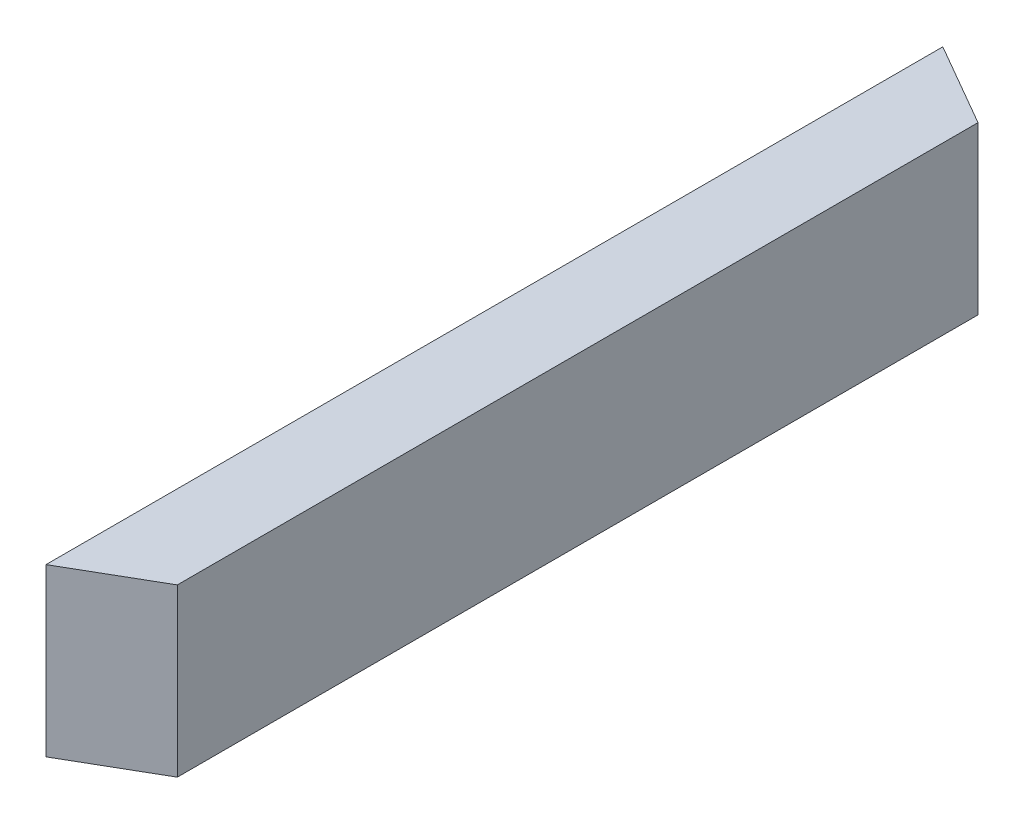
ISO-10303-21;
HEADER;
FILE_DESCRIPTION(('STEP AP214'),'2;1');
FILE_NAME('part.step','',(''),(''),'','','');
FILE_SCHEMA(('AUTOMOTIVE_DESIGN { 1 0 10303 214 1 1 1 1 }'));
ENDSEC;
DATA;
#1=APPLICATION_CONTEXT('core data for automotive mechanical design processes');
#2=APPLICATION_PROTOCOL_DEFINITION('international standard','automotive_design',2000,#1);
#3=PRODUCT_CONTEXT('',#1,'mechanical');
#4=PRODUCT('Part','Part','',(#3));
#5=PRODUCT_RELATED_PRODUCT_CATEGORY('part','',(#4));
#6=PRODUCT_DEFINITION_FORMATION('','',#4);
#7=PRODUCT_DEFINITION_CONTEXT('part definition',#1,'design');
#8=PRODUCT_DEFINITION('design','',#6,#7);
#9=PRODUCT_DEFINITION_SHAPE('','',#8);
#10=(LENGTH_UNIT() NAMED_UNIT(*) SI_UNIT(.MILLI.,.METRE.));
#11=(NAMED_UNIT(*) PLANE_ANGLE_UNIT() SI_UNIT($,.RADIAN.));
#12=(NAMED_UNIT(*) SI_UNIT($,.STERADIAN.) SOLID_ANGLE_UNIT());
#13=UNCERTAINTY_MEASURE_WITH_UNIT(LENGTH_MEASURE(1.E-05),#10,'distance_accuracy_value','');
#14=(GEOMETRIC_REPRESENTATION_CONTEXT(3) GLOBAL_UNCERTAINTY_ASSIGNED_CONTEXT((#13)) GLOBAL_UNIT_ASSIGNED_CONTEXT((#10,
#11,#12)) REPRESENTATION_CONTEXT('',''));
#15=CARTESIAN_POINT('',(0.,0.,0.));
#16=DIRECTION('',(0.,0.,1.));
#17=DIRECTION('',(1.,0.,0.));
#18=AXIS2_PLACEMENT_3D('',#15,#16,#17);
#19=CARTESIAN_POINT('',(0.,0.,478.79));
#20=DIRECTION('',(-1.,0.,0.));
#21=DIRECTION('',(0.,0.,1.));
#22=AXIS2_PLACEMENT_3D('',#19,#20,#21);
#23=PLANE('',#22);
#24=DIRECTION('',(0.,0.,-1.));
#25=VECTOR('',#24,1.);
#26=CARTESIAN_POINT('',(0.,0.,478.79));
#27=LINE('',#26,#25);
#28=CARTESIAN_POINT('',(0.,-1.11022302462516E-13,453.126780534521));
#29=VERTEX_POINT('',#28);
#30=CARTESIAN_POINT('',(0.,-1.11022302462516E-13,25.6632194654785));
#31=VERTEX_POINT('',#30);
#32=EDGE_CURVE('E89',#29,#31,#27,.T.);
#33=ORIENTED_EDGE('',*,*,#32,.T.);
#34=DIRECTION('',(0.,1.,0.));
#35=VECTOR('',#34,1.);
#36=CARTESIAN_POINT('',(0.,-389.89,25.6632194654785));
#37=LINE('',#36,#35);
#38=CARTESIAN_POINT('',(0.,88.9,25.6632194654785));
#39=VERTEX_POINT('',#38);
#40=EDGE_CURVE('E85',#31,#39,#37,.T.);
#41=ORIENTED_EDGE('',*,*,#40,.T.);
#42=DIRECTION('',(0.,0.,-1.));
#43=VECTOR('',#42,1.);
#44=CARTESIAN_POINT('',(0.,88.9,478.79));
#45=LINE('',#44,#43);
#46=CARTESIAN_POINT('',(0.,88.9,453.126780534521));
#47=VERTEX_POINT('',#46);
#48=EDGE_CURVE('E11',#47,#39,#45,.T.);
#49=ORIENTED_EDGE('',*,*,#48,.F.);
#50=DIRECTION('',(0.,1.,0.));
#51=VECTOR('',#50,1.);
#52=CARTESIAN_POINT('',(0.,-389.89,453.126780534521));
#53=LINE('',#52,#51);
#54=EDGE_CURVE('E98',#29,#47,#53,.T.);
#55=ORIENTED_EDGE('',*,*,#54,.F.);
#56=EDGE_LOOP('',(#33,#41,#49,#55));
#57=FACE_BOUND('',#56,.T.);
#58=ADVANCED_FACE('F32',(#57),#23,.F.);
#59=CARTESIAN_POINT('',(0.,88.9,478.79));
#60=DIRECTION('',(0.,-1.,0.));
#61=DIRECTION('',(0.,0.,-1.));
#62=AXIS2_PLACEMENT_3D('',#59,#60,#61);
#63=PLANE('',#62);
#64=ORIENTED_EDGE('',*,*,#48,.T.);
#65=DIRECTION('',(0.866025403784442,0.,0.499999999999995));
#66=VECTOR('',#65,1.);
#67=CARTESIAN_POINT('',(-44.45,88.9,0.));
#68=LINE('',#67,#66);
#69=CARTESIAN_POINT('',(-44.45,88.9,0.));
#70=VERTEX_POINT('',#69);
#71=EDGE_CURVE('E70',#70,#39,#68,.T.);
#72=ORIENTED_EDGE('',*,*,#71,.F.);
#73=DIRECTION('',(0.,0.,-1.));
#74=VECTOR('',#73,1.);
#75=CARTESIAN_POINT('',(-44.45,88.9,478.79));
#76=LINE('',#75,#74);
#77=CARTESIAN_POINT('',(-44.45,88.9,478.79));
#78=VERTEX_POINT('',#77);
#79=EDGE_CURVE('E40',#78,#70,#76,.T.);
#80=ORIENTED_EDGE('',*,*,#79,.F.);
#81=DIRECTION('',(0.866025403784436,0.,-0.500000000000004));
#82=VECTOR('',#81,1.);
#83=CARTESIAN_POINT('',(-44.45,88.9,478.79));
#84=LINE('',#83,#82);
#85=EDGE_CURVE('E46',#78,#47,#84,.T.);
#86=ORIENTED_EDGE('',*,*,#85,.T.);
#87=EDGE_LOOP('',(#64,#72,#80,#86));
#88=FACE_BOUND('',#87,.T.);
#89=ADVANCED_FACE('F82',(#88),#63,.F.);
#90=CARTESIAN_POINT('',(0.,0.,478.79));
#91=DIRECTION('',(0.,1.,0.));
#92=DIRECTION('',(-1.,0.,0.));
#93=AXIS2_PLACEMENT_3D('',#90,#91,#92);
#94=PLANE('',#93);
#95=DIRECTION('',(0.,0.,-1.));
#96=VECTOR('',#95,1.);
#97=CARTESIAN_POINT('',(-44.45,0.,478.79));
#98=LINE('',#97,#96);
#99=CARTESIAN_POINT('',(-44.45,-1.11022302462516E-13,478.79));
#100=VERTEX_POINT('',#99);
#101=CARTESIAN_POINT('',(-44.45,0.,0.));
#102=VERTEX_POINT('',#101);
#103=EDGE_CURVE('E88',#100,#102,#98,.T.);
#104=ORIENTED_EDGE('',*,*,#103,.T.);
#105=DIRECTION('',(0.866025403784442,0.,0.499999999999995));
#106=VECTOR('',#105,1.);
#107=CARTESIAN_POINT('',(196.209651538974,0.,138.944914599106));
#108=LINE('',#107,#106);
#109=EDGE_CURVE('E73',#102,#31,#108,.T.);
#110=ORIENTED_EDGE('',*,*,#109,.T.);
#111=ORIENTED_EDGE('',*,*,#32,.F.);
#112=DIRECTION('',(0.866025403784436,0.,-0.500000000000005));
#113=VECTOR('',#112,1.);
#114=CARTESIAN_POINT('',(-11.1125000000002,0.,459.542585400891));
#115=LINE('',#114,#113);
#116=EDGE_CURVE('E79',#100,#29,#115,.T.);
#117=ORIENTED_EDGE('',*,*,#116,.F.);
#118=EDGE_LOOP('',(#104,#110,#111,#117));
#119=FACE_BOUND('',#118,.T.);
#120=ADVANCED_FACE('F104',(#119),#94,.F.);
#121=CARTESIAN_POINT('',(-44.45,0.,478.79));
#122=DIRECTION('',(1.,0.,0.));
#123=DIRECTION('',(0.,0.,-1.));
#124=AXIS2_PLACEMENT_3D('',#121,#122,#123);
#125=PLANE('',#124);
#126=DIRECTION('',(0.,-1.,0.));
#127=VECTOR('',#126,1.);
#128=CARTESIAN_POINT('',(-44.45,0.,0.));
#129=LINE('',#128,#127);
#130=EDGE_CURVE('E67',#70,#102,#129,.T.);
#131=ORIENTED_EDGE('',*,*,#130,.T.);
#132=ORIENTED_EDGE('',*,*,#103,.F.);
#133=DIRECTION('',(0.,-1.,0.));
#134=VECTOR('',#133,1.);
#135=CARTESIAN_POINT('',(-44.45,0.,478.79));
#136=LINE('',#135,#134);
#137=EDGE_CURVE('E78',#78,#100,#136,.T.);
#138=ORIENTED_EDGE('',*,*,#137,.F.);
#139=ORIENTED_EDGE('',*,*,#79,.T.);
#140=EDGE_LOOP('',(#131,#132,#138,#139));
#141=FACE_BOUND('',#140,.T.);
#142=ADVANCED_FACE('F87',(#141),#125,.F.);
#143=CARTESIAN_POINT('',(-44.45,-389.89,0.));
#144=DIRECTION('',(-0.499999999999995,0.,0.866025403784442));
#145=DIRECTION('',(0.866025403784442,0.,0.499999999999995));
#146=AXIS2_PLACEMENT_3D('',#143,#144,#145);
#147=PLANE('',#146);
#148=ORIENTED_EDGE('',*,*,#130,.F.);
#149=ORIENTED_EDGE('',*,*,#71,.T.);
#150=ORIENTED_EDGE('',*,*,#40,.F.);
#151=ORIENTED_EDGE('',*,*,#109,.F.);
#152=EDGE_LOOP('',(#148,#149,#150,#151));
#153=FACE_BOUND('',#152,.T.);
#154=ADVANCED_FACE('F69',(#153),#147,.F.);
#155=CARTESIAN_POINT('',(-44.45,-389.89,478.79));
#156=DIRECTION('',(0.500000000000004,0.,0.866025403784436));
#157=DIRECTION('',(0.866025403784436,0.,-0.500000000000005));
#158=AXIS2_PLACEMENT_3D('',#155,#156,#157);
#159=PLANE('',#158);
#160=ORIENTED_EDGE('',*,*,#116,.T.);
#161=ORIENTED_EDGE('',*,*,#54,.T.);
#162=ORIENTED_EDGE('',*,*,#85,.F.);
#163=ORIENTED_EDGE('',*,*,#137,.T.);
#164=EDGE_LOOP('',(#160,#161,#162,#163));
#165=FACE_BOUND('',#164,.T.);
#166=ADVANCED_FACE('F106',(#165),#159,.T.);
#167=CLOSED_SHELL('',(#58,#89,#120,#142,#154,#166));
#168=MANIFOLD_SOLID_BREP('B2',#167);
#169=ADVANCED_BREP_SHAPE_REPRESENTATION('',(#18,#168),#14);
#170=SHAPE_DEFINITION_REPRESENTATION(#9,#169);
ENDSEC;
END-ISO-10303-21;
